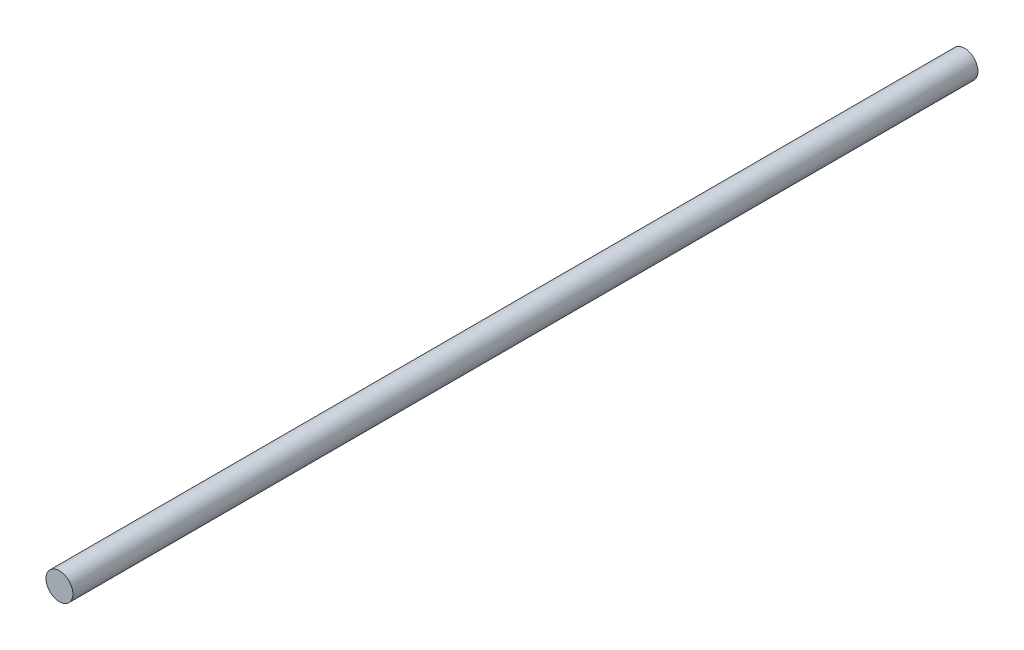
ISO-10303-21;
HEADER;
FILE_DESCRIPTION(('STEP AP214'),'2;1');
FILE_NAME('part.step','',(''),(''),'','','');
FILE_SCHEMA(('AUTOMOTIVE_DESIGN { 1 0 10303 214 1 1 1 1 }'));
ENDSEC;
DATA;
#1=APPLICATION_CONTEXT('core data for automotive mechanical design processes');
#2=APPLICATION_PROTOCOL_DEFINITION('international standard','automotive_design',2000,#1);
#3=PRODUCT_CONTEXT('',#1,'mechanical');
#4=PRODUCT('Part','Part','',(#3));
#5=PRODUCT_RELATED_PRODUCT_CATEGORY('part','',(#4));
#6=PRODUCT_DEFINITION_FORMATION('','',#4);
#7=PRODUCT_DEFINITION_CONTEXT('part definition',#1,'design');
#8=PRODUCT_DEFINITION('design','',#6,#7);
#9=PRODUCT_DEFINITION_SHAPE('','',#8);
#10=(LENGTH_UNIT() NAMED_UNIT(*) SI_UNIT(.MILLI.,.METRE.));
#11=(NAMED_UNIT(*) PLANE_ANGLE_UNIT() SI_UNIT($,.RADIAN.));
#12=(NAMED_UNIT(*) SI_UNIT($,.STERADIAN.) SOLID_ANGLE_UNIT());
#13=UNCERTAINTY_MEASURE_WITH_UNIT(LENGTH_MEASURE(1.E-05),#10,'distance_accuracy_value','');
#14=(GEOMETRIC_REPRESENTATION_CONTEXT(3) GLOBAL_UNCERTAINTY_ASSIGNED_CONTEXT((#13)) GLOBAL_UNIT_ASSIGNED_CONTEXT((#10,
#11,#12)) REPRESENTATION_CONTEXT('',''));
#15=CARTESIAN_POINT('',(0.,0.,0.));
#16=DIRECTION('',(0.,0.,1.));
#17=DIRECTION('',(1.,0.,0.));
#18=AXIS2_PLACEMENT_3D('',#15,#16,#17);
#19=CARTESIAN_POINT('',(0.,0.,320.));
#20=DIRECTION('',(0.,0.,-1.));
#21=DIRECTION('',(-1.,0.,0.));
#22=AXIS2_PLACEMENT_3D('',#19,#20,#21);
#23=CYLINDRICAL_SURFACE('',#22,4.75);
#24=CARTESIAN_POINT('',(0.,0.,320.));
#25=DIRECTION('',(0.,0.,1.));
#26=DIRECTION('',(1.,0.,0.));
#27=AXIS2_PLACEMENT_3D('',#24,#25,#26);
#28=CIRCLE('',#27,4.75);
#29=CARTESIAN_POINT('',(4.75,0.,320.));
#30=VERTEX_POINT('',#29);
#31=EDGE_CURVE('E10',#30,#30,#28,.T.);
#32=ORIENTED_EDGE('',*,*,#31,.F.);
#33=EDGE_LOOP('',(#32));
#34=FACE_BOUND('',#33,.T.);
#35=CARTESIAN_POINT('',(0.,0.,0.));
#36=DIRECTION('',(0.,0.,1.));
#37=DIRECTION('',(1.,0.,0.));
#38=AXIS2_PLACEMENT_3D('',#35,#36,#37);
#39=CIRCLE('',#38,4.75);
#40=CARTESIAN_POINT('',(4.75,0.,0.));
#41=VERTEX_POINT('',#40);
#42=EDGE_CURVE('E34',#41,#41,#39,.T.);
#43=ORIENTED_EDGE('',*,*,#42,.T.);
#44=EDGE_LOOP('',(#43));
#45=FACE_BOUND('',#44,.T.);
#46=ADVANCED_FACE('F31',(#34,#45),#23,.T.);
#47=CARTESIAN_POINT('',(0.,0.,320.));
#48=DIRECTION('',(0.,0.,1.));
#49=DIRECTION('',(1.,0.,0.));
#50=AXIS2_PLACEMENT_3D('',#47,#48,#49);
#51=PLANE('',#50);
#52=ORIENTED_EDGE('',*,*,#31,.T.);
#53=EDGE_LOOP('',(#52));
#54=FACE_BOUND('',#53,.T.);
#55=ADVANCED_FACE('F46',(#54),#51,.T.);
#56=CARTESIAN_POINT('',(0.,0.,0.));
#57=DIRECTION('',(0.,0.,1.));
#58=DIRECTION('',(1.,0.,0.));
#59=AXIS2_PLACEMENT_3D('',#56,#57,#58);
#60=PLANE('',#59);
#61=ORIENTED_EDGE('',*,*,#42,.F.);
#62=EDGE_LOOP('',(#61));
#63=FACE_BOUND('',#62,.T.);
#64=ADVANCED_FACE('F44',(#63),#60,.F.);
#65=CLOSED_SHELL('',(#46,#55,#64));
#66=MANIFOLD_SOLID_BREP('B2',#65);
#67=ADVANCED_BREP_SHAPE_REPRESENTATION('',(#18,#66),#14);
#68=SHAPE_DEFINITION_REPRESENTATION(#9,#67);
ENDSEC;
END-ISO-10303-21;
